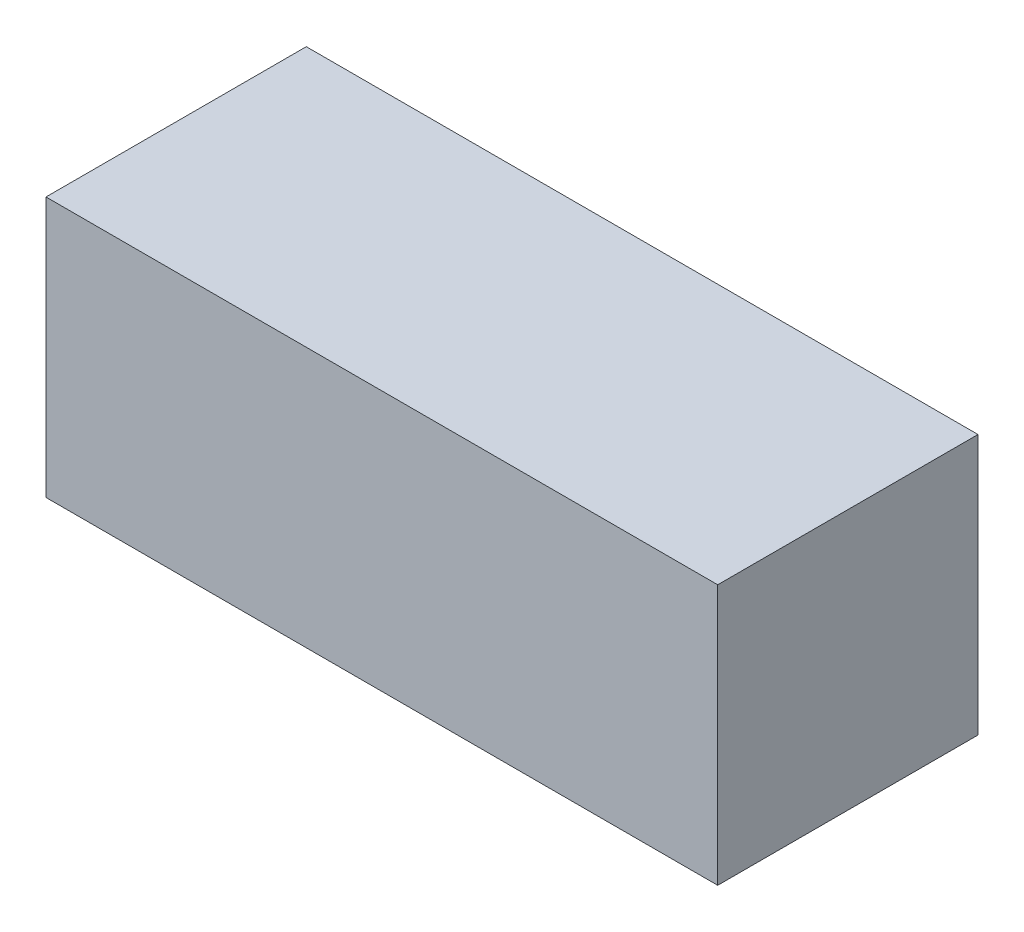
ISO-10303-21;
HEADER;
FILE_DESCRIPTION(('STEP AP214'),'2;1');
FILE_NAME('part.step','',(''),(''),'','','');
FILE_SCHEMA(('AUTOMOTIVE_DESIGN { 1 0 10303 214 1 1 1 1 }'));
ENDSEC;
DATA;
#1=APPLICATION_CONTEXT('core data for automotive mechanical design processes');
#2=APPLICATION_PROTOCOL_DEFINITION('international standard','automotive_design',2000,#1);
#3=PRODUCT_CONTEXT('',#1,'mechanical');
#4=PRODUCT('Part','Part','',(#3));
#5=PRODUCT_RELATED_PRODUCT_CATEGORY('part','',(#4));
#6=PRODUCT_DEFINITION_FORMATION('','',#4);
#7=PRODUCT_DEFINITION_CONTEXT('part definition',#1,'design');
#8=PRODUCT_DEFINITION('design','',#6,#7);
#9=PRODUCT_DEFINITION_SHAPE('','',#8);
#10=(LENGTH_UNIT() NAMED_UNIT(*) SI_UNIT(.MILLI.,.METRE.));
#11=(NAMED_UNIT(*) PLANE_ANGLE_UNIT() SI_UNIT($,.RADIAN.));
#12=(NAMED_UNIT(*) SI_UNIT($,.STERADIAN.) SOLID_ANGLE_UNIT());
#13=UNCERTAINTY_MEASURE_WITH_UNIT(LENGTH_MEASURE(1.E-05),#10,'distance_accuracy_value','');
#14=(GEOMETRIC_REPRESENTATION_CONTEXT(3) GLOBAL_UNCERTAINTY_ASSIGNED_CONTEXT((#13)) GLOBAL_UNIT_ASSIGNED_CONTEXT((#10,
#11,#12)) REPRESENTATION_CONTEXT('',''));
#15=CARTESIAN_POINT('',(0.,0.,0.));
#16=DIRECTION('',(0.,0.,1.));
#17=DIRECTION('',(1.,0.,0.));
#18=AXIS2_PLACEMENT_3D('',#15,#16,#17);
#19=CARTESIAN_POINT('',(2.93951971199339E-13,2362.2,-1181.1));
#20=DIRECTION('',(1.,0.,0.));
#21=DIRECTION('',(0.,0.,-1.));
#22=AXIS2_PLACEMENT_3D('',#19,#20,#21);
#23=PLANE('',#22);
#24=DIRECTION('',(0.,0.,1.));
#25=VECTOR('',#24,1.);
#26=CARTESIAN_POINT('',(2.93951971199339E-13,0.,-1181.1));
#27=LINE('',#26,#25);
#28=CARTESIAN_POINT('',(2.93951971199339E-13,0.,-1181.1));
#29=VERTEX_POINT('',#28);
#30=CARTESIAN_POINT('',(2.93951971199339E-13,0.,1181.1));
#31=VERTEX_POINT('',#30);
#32=EDGE_CURVE('E94',#29,#31,#27,.T.);
#33=ORIENTED_EDGE('',*,*,#32,.T.);
#34=DIRECTION('',(0.,-1.,0.));
#35=VECTOR('',#34,1.);
#36=CARTESIAN_POINT('',(2.93951971199339E-13,2362.2,1181.1));
#37=LINE('',#36,#35);
#38=CARTESIAN_POINT('',(2.93951971199339E-13,2362.2,1181.1));
#39=VERTEX_POINT('',#38);
#40=EDGE_CURVE('E11',#39,#31,#37,.T.);
#41=ORIENTED_EDGE('',*,*,#40,.F.);
#42=DIRECTION('',(0.,0.,1.));
#43=VECTOR('',#42,1.);
#44=CARTESIAN_POINT('',(2.93951971199339E-13,2362.2,-1181.1));
#45=LINE('',#44,#43);
#46=CARTESIAN_POINT('',(2.93951971199339E-13,2362.2,-1181.1));
#47=VERTEX_POINT('',#46);
#48=EDGE_CURVE('E82',#47,#39,#45,.T.);
#49=ORIENTED_EDGE('',*,*,#48,.F.);
#50=DIRECTION('',(0.,-1.,0.));
#51=VECTOR('',#50,1.);
#52=CARTESIAN_POINT('',(2.93951971199339E-13,2362.2,-1181.1));
#53=LINE('',#52,#51);
#54=EDGE_CURVE('E90',#47,#29,#53,.T.);
#55=ORIENTED_EDGE('',*,*,#54,.T.);
#56=EDGE_LOOP('',(#33,#41,#49,#55));
#57=FACE_BOUND('',#56,.T.);
#58=ADVANCED_FACE('F31',(#57),#23,.F.);
#59=CARTESIAN_POINT('',(2.93951971199339E-13,2362.2,1181.1));
#60=DIRECTION('',(0.,0.,-1.));
#61=DIRECTION('',(-1.,0.,0.));
#62=AXIS2_PLACEMENT_3D('',#59,#60,#61);
#63=PLANE('',#62);
#64=DIRECTION('',(1.,0.,0.));
#65=VECTOR('',#64,1.);
#66=CARTESIAN_POINT('',(2.93951971199339E-13,0.,1181.1));
#67=LINE('',#66,#65);
#68=CARTESIAN_POINT('',(6096.,0.,1181.1));
#69=VERTEX_POINT('',#68);
#70=EDGE_CURVE('E86',#31,#69,#67,.T.);
#71=ORIENTED_EDGE('',*,*,#70,.T.);
#72=DIRECTION('',(0.,-1.,0.));
#73=VECTOR('',#72,1.);
#74=CARTESIAN_POINT('',(6096.,2362.2,1181.1));
#75=LINE('',#74,#73);
#76=CARTESIAN_POINT('',(6096.,2362.2,1181.1));
#77=VERTEX_POINT('',#76);
#78=EDGE_CURVE('E39',#77,#69,#75,.T.);
#79=ORIENTED_EDGE('',*,*,#78,.F.);
#80=DIRECTION('',(1.,0.,0.));
#81=VECTOR('',#80,1.);
#82=CARTESIAN_POINT('',(2.93951971199339E-13,2362.2,1181.1));
#83=LINE('',#82,#81);
#84=EDGE_CURVE('E77',#39,#77,#83,.T.);
#85=ORIENTED_EDGE('',*,*,#84,.F.);
#86=ORIENTED_EDGE('',*,*,#40,.T.);
#87=EDGE_LOOP('',(#71,#79,#85,#86));
#88=FACE_BOUND('',#87,.T.);
#89=ADVANCED_FACE('F85',(#88),#63,.F.);
#90=CARTESIAN_POINT('',(6096.,2362.2,-1181.1));
#91=DIRECTION('',(-1.,0.,0.));
#92=DIRECTION('',(0.,0.,1.));
#93=AXIS2_PLACEMENT_3D('',#90,#91,#92);
#94=PLANE('',#93);
#95=DIRECTION('',(0.,0.,-1.));
#96=VECTOR('',#95,1.);
#97=CARTESIAN_POINT('',(6096.,0.,-1181.1));
#98=LINE('',#97,#96);
#99=CARTESIAN_POINT('',(6096.,0.,-1181.1));
#100=VERTEX_POINT('',#99);
#101=EDGE_CURVE('E64',#69,#100,#98,.T.);
#102=ORIENTED_EDGE('',*,*,#101,.T.);
#103=DIRECTION('',(0.,-1.,0.));
#104=VECTOR('',#103,1.);
#105=CARTESIAN_POINT('',(6096.,2362.2,-1181.1));
#106=LINE('',#105,#104);
#107=CARTESIAN_POINT('',(6096.,2362.2,-1181.1));
#108=VERTEX_POINT('',#107);
#109=EDGE_CURVE('E87',#108,#100,#106,.T.);
#110=ORIENTED_EDGE('',*,*,#109,.F.);
#111=DIRECTION('',(0.,0.,-1.));
#112=VECTOR('',#111,1.);
#113=CARTESIAN_POINT('',(6096.,2362.2,-1181.1));
#114=LINE('',#113,#112);
#115=EDGE_CURVE('E80',#77,#108,#114,.T.);
#116=ORIENTED_EDGE('',*,*,#115,.F.);
#117=ORIENTED_EDGE('',*,*,#78,.T.);
#118=EDGE_LOOP('',(#102,#110,#116,#117));
#119=FACE_BOUND('',#118,.T.);
#120=ADVANCED_FACE('F88',(#119),#94,.F.);
#121=CARTESIAN_POINT('',(2.93951971199339E-13,2362.2,-1181.1));
#122=DIRECTION('',(0.,0.,1.));
#123=DIRECTION('',(1.,0.,0.));
#124=AXIS2_PLACEMENT_3D('',#121,#122,#123);
#125=PLANE('',#124);
#126=DIRECTION('',(-1.,0.,0.));
#127=VECTOR('',#126,1.);
#128=CARTESIAN_POINT('',(2.93951971199339E-13,0.,-1181.1));
#129=LINE('',#128,#127);
#130=EDGE_CURVE('E70',#100,#29,#129,.T.);
#131=ORIENTED_EDGE('',*,*,#130,.T.);
#132=ORIENTED_EDGE('',*,*,#54,.F.);
#133=DIRECTION('',(-1.,0.,0.));
#134=VECTOR('',#133,1.);
#135=CARTESIAN_POINT('',(2.93951971199339E-13,2362.2,-1181.1));
#136=LINE('',#135,#134);
#137=EDGE_CURVE('E47',#108,#47,#136,.T.);
#138=ORIENTED_EDGE('',*,*,#137,.F.);
#139=ORIENTED_EDGE('',*,*,#109,.T.);
#140=EDGE_LOOP('',(#131,#132,#138,#139));
#141=FACE_BOUND('',#140,.T.);
#142=ADVANCED_FACE('F101',(#141),#125,.F.);
#143=CARTESIAN_POINT('',(2.93951971199339E-13,2362.2,1181.1));
#144=DIRECTION('',(0.,1.,0.));
#145=DIRECTION('',(0.,0.,1.));
#146=AXIS2_PLACEMENT_3D('',#143,#144,#145);
#147=PLANE('',#146);
#148=ORIENTED_EDGE('',*,*,#48,.T.);
#149=ORIENTED_EDGE('',*,*,#84,.T.);
#150=ORIENTED_EDGE('',*,*,#115,.T.);
#151=ORIENTED_EDGE('',*,*,#137,.T.);
#152=EDGE_LOOP('',(#148,#149,#150,#151));
#153=FACE_BOUND('',#152,.T.);
#154=ADVANCED_FACE('F78',(#153),#147,.T.);
#155=CARTESIAN_POINT('',(2.93951971199339E-13,0.,1181.1));
#156=DIRECTION('',(0.,1.,0.));
#157=DIRECTION('',(0.,0.,1.));
#158=AXIS2_PLACEMENT_3D('',#155,#156,#157);
#159=PLANE('',#158);
#160=ORIENTED_EDGE('',*,*,#32,.F.);
#161=ORIENTED_EDGE('',*,*,#130,.F.);
#162=ORIENTED_EDGE('',*,*,#101,.F.);
#163=ORIENTED_EDGE('',*,*,#70,.F.);
#164=EDGE_LOOP('',(#160,#161,#162,#163));
#165=FACE_BOUND('',#164,.T.);
#166=ADVANCED_FACE('F104',(#165),#159,.F.);
#167=CLOSED_SHELL('',(#58,#89,#120,#142,#154,#166));
#168=MANIFOLD_SOLID_BREP('B2',#167);
#169=ADVANCED_BREP_SHAPE_REPRESENTATION('',(#18,#168),#14);
#170=SHAPE_DEFINITION_REPRESENTATION(#9,#169);
ENDSEC;
END-ISO-10303-21;
